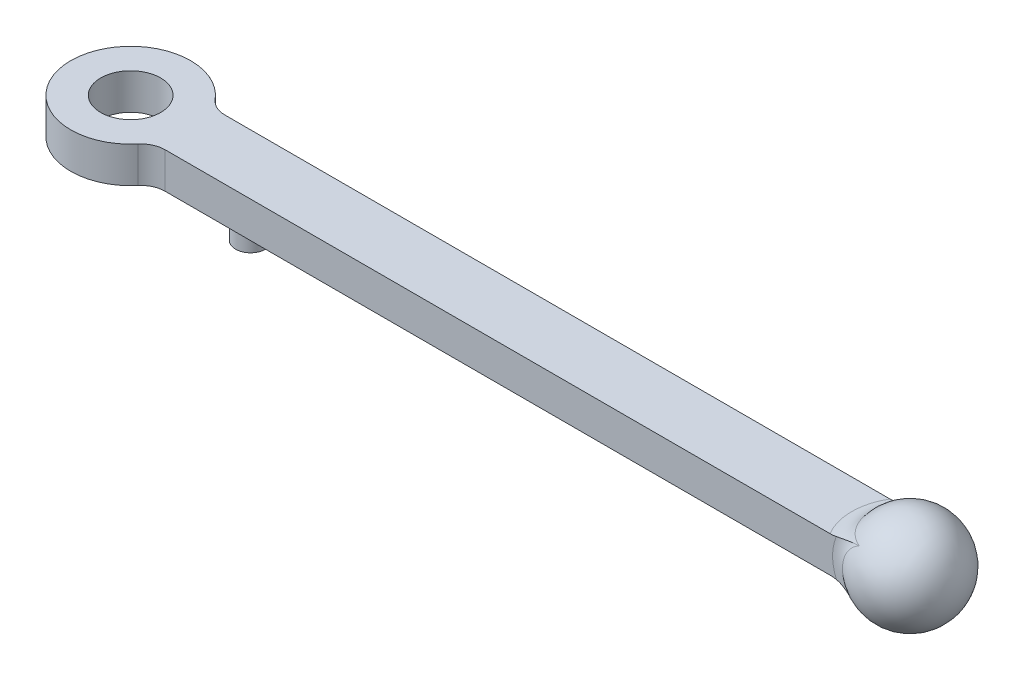
ISO-10303-21;
HEADER;
FILE_DESCRIPTION(('STEP AP214'),'2;1');
FILE_NAME('part.step','',(''),(''),'','','');
FILE_SCHEMA(('AUTOMOTIVE_DESIGN { 1 0 10303 214 1 1 1 1 }'));
ENDSEC;
DATA;
#1=APPLICATION_CONTEXT('core data for automotive mechanical design processes');
#2=APPLICATION_PROTOCOL_DEFINITION('international standard','automotive_design',2000,#1);
#3=PRODUCT_CONTEXT('',#1,'mechanical');
#4=PRODUCT('Part','Part','',(#3));
#5=PRODUCT_RELATED_PRODUCT_CATEGORY('part','',(#4));
#6=PRODUCT_DEFINITION_FORMATION('','',#4);
#7=PRODUCT_DEFINITION_CONTEXT('part definition',#1,'design');
#8=PRODUCT_DEFINITION('design','',#6,#7);
#9=PRODUCT_DEFINITION_SHAPE('','',#8);
#10=(LENGTH_UNIT() NAMED_UNIT(*) SI_UNIT(.MILLI.,.METRE.));
#11=(NAMED_UNIT(*) PLANE_ANGLE_UNIT() SI_UNIT($,.RADIAN.));
#12=(NAMED_UNIT(*) SI_UNIT($,.STERADIAN.) SOLID_ANGLE_UNIT());
#13=UNCERTAINTY_MEASURE_WITH_UNIT(LENGTH_MEASURE(1.E-05),#10,'distance_accuracy_value','');
#14=(GEOMETRIC_REPRESENTATION_CONTEXT(3) GLOBAL_UNCERTAINTY_ASSIGNED_CONTEXT((#13)) GLOBAL_UNIT_ASSIGNED_CONTEXT((#10,
#11,#12)) REPRESENTATION_CONTEXT('',''));
#15=CARTESIAN_POINT('',(0.,0.,0.));
#16=DIRECTION('',(0.,0.,1.));
#17=DIRECTION('',(1.,0.,0.));
#18=AXIS2_PLACEMENT_3D('',#15,#16,#17);
#19=CARTESIAN_POINT('',(0.,6.,0.));
#20=DIRECTION('',(0.,-1.,0.));
#21=DIRECTION('',(0.,0.,-1.));
#22=AXIS2_PLACEMENT_3D('',#19,#20,#21);
#23=CYLINDRICAL_SURFACE('',#22,10.);
#24=CARTESIAN_POINT('',(0.,6.,0.));
#25=DIRECTION('',(0.,1.,0.));
#26=DIRECTION('',(0.,0.,1.));
#27=AXIS2_PLACEMENT_3D('',#24,#25,#26);
#28=CIRCLE('',#27,10.);
#29=CARTESIAN_POINT('',(7.65986092483116,6.,-6.42857142857142));
#30=VERTEX_POINT('',#29);
#31=CARTESIAN_POINT('',(7.65986092483116,6.,6.42857142857142));
#32=VERTEX_POINT('',#31);
#33=EDGE_CURVE('E146',#30,#32,#28,.T.);
#34=ORIENTED_EDGE('',*,*,#33,.F.);
#35=DIRECTION('',(0.,-1.,0.));
#36=VECTOR('',#35,1.);
#37=CARTESIAN_POINT('',(7.65986092483116,6.,-6.42857142857142));
#38=LINE('',#37,#36);
#39=CARTESIAN_POINT('',(7.65986092483116,0.,-6.42857142857142));
#40=VERTEX_POINT('',#39);
#41=EDGE_CURVE('E132',#30,#40,#38,.T.);
#42=ORIENTED_EDGE('',*,*,#41,.T.);
#43=CARTESIAN_POINT('',(0.,0.,0.));
#44=DIRECTION('',(0.,1.,0.));
#45=DIRECTION('',(0.,0.,1.));
#46=AXIS2_PLACEMENT_3D('',#43,#44,#45);
#47=CIRCLE('',#46,10.);
#48=CARTESIAN_POINT('',(7.65986092483116,0.,6.42857142857142));
#49=VERTEX_POINT('',#48);
#50=EDGE_CURVE('E143',#40,#49,#47,.T.);
#51=ORIENTED_EDGE('',*,*,#50,.T.);
#52=DIRECTION('',(0.,-1.,0.));
#53=VECTOR('',#52,1.);
#54=CARTESIAN_POINT('',(7.65986092483116,6.,6.42857142857142));
#55=LINE('',#54,#53);
#56=EDGE_CURVE('E147',#49,#32,#55,.F.);
#57=ORIENTED_EDGE('',*,*,#56,.T.);
#58=EDGE_LOOP('',(#34,#42,#51,#57));
#59=FACE_BOUND('',#58,.T.);
#60=ADVANCED_FACE('F50',(#59),#23,.T.);
#61=CARTESIAN_POINT('',(0.,6.,0.));
#62=DIRECTION('',(0.,1.,0.));
#63=DIRECTION('',(0.,0.,1.));
#64=AXIS2_PLACEMENT_3D('',#61,#62,#63);
#65=PLANE('',#64);
#66=CARTESIAN_POINT('',(0.,6.,0.));
#67=DIRECTION('',(0.,-1.,0.));
#68=DIRECTION('',(0.,0.,-1.));
#69=AXIS2_PLACEMENT_3D('',#66,#67,#68);
#70=CIRCLE('',#69,5.);
#71=CARTESIAN_POINT('',(0.,6.,-5.));
#72=VERTEX_POINT('',#71);
#73=EDGE_CURVE('E257',#72,#72,#70,.T.);
#74=ORIENTED_EDGE('',*,*,#73,.T.);
#75=EDGE_LOOP('',(#74));
#76=FACE_BOUND('',#75,.T.);
#77=DIRECTION('',(-1.,0.,0.));
#78=VECTOR('',#77,1.);
#79=CARTESIAN_POINT('',(130.,6.,4.99999999999999));
#80=LINE('',#79,#78);
#81=CARTESIAN_POINT('',(121.633399734659,6.,4.99999999999999));
#82=VERTEX_POINT('',#81);
#83=CARTESIAN_POINT('',(10.7238052947636,6.,4.99999999999999));
#84=VERTEX_POINT('',#83);
#85=EDGE_CURVE('E152',#82,#84,#80,.T.);
#86=ORIENTED_EDGE('',*,*,#85,.F.);
#87=CARTESIAN_POINT('',(130.,6.,0.));
#88=DIRECTION('',(0.,1.,0.));
#89=DIRECTION('',(0.,0.,1.));
#90=AXIS2_PLACEMENT_3D('',#87,#88,#89);
#91=CIRCLE('',#90,9.74679434480898);
#92=CARTESIAN_POINT('',(121.633399734659,6.,-4.99999999999999));
#93=VERTEX_POINT('',#92);
#94=EDGE_CURVE('E179',#82,#93,#91,.F.);
#95=ORIENTED_EDGE('',*,*,#94,.T.);
#96=DIRECTION('',(-1.,0.,0.));
#97=VECTOR('',#96,1.);
#98=CARTESIAN_POINT('',(130.,6.,-4.99999999999999));
#99=LINE('',#98,#97);
#100=CARTESIAN_POINT('',(10.7238052947636,6.,-4.99999999999999));
#101=VERTEX_POINT('',#100);
#102=EDGE_CURVE('E156',#93,#101,#99,.T.);
#103=ORIENTED_EDGE('',*,*,#102,.T.);
#104=CARTESIAN_POINT('',(10.7238052947636,6.,-8.99999999999999));
#105=DIRECTION('',(0.,1.,0.));
#106=DIRECTION('',(0.,0.,1.));
#107=AXIS2_PLACEMENT_3D('',#104,#105,#106);
#108=CIRCLE('',#107,4.);
#109=EDGE_CURVE('E138',#101,#30,#108,.F.);
#110=ORIENTED_EDGE('',*,*,#109,.T.);
#111=ORIENTED_EDGE('',*,*,#33,.T.);
#112=CARTESIAN_POINT('',(10.7238052947636,6.,8.99999999999999));
#113=DIRECTION('',(0.,1.,0.));
#114=DIRECTION('',(0.,0.,1.));
#115=AXIS2_PLACEMENT_3D('',#112,#113,#114);
#116=CIRCLE('',#115,4.);
#117=EDGE_CURVE('E58',#32,#84,#116,.F.);
#118=ORIENTED_EDGE('',*,*,#117,.T.);
#119=EDGE_LOOP('',(#86,#95,#103,#110,#111,#118));
#120=FACE_BOUND('',#119,.T.);
#121=ADVANCED_FACE('F279',(#76,#120),#65,.T.);
#122=CARTESIAN_POINT('',(0.,0.,0.));
#123=DIRECTION('',(0.,1.,0.));
#124=DIRECTION('',(0.,0.,1.));
#125=AXIS2_PLACEMENT_3D('',#122,#123,#124);
#126=PLANE('',#125);
#127=CARTESIAN_POINT('',(20.,0.,0.));
#128=DIRECTION('',(0.,1.,0.));
#129=DIRECTION('',(0.,0.,1.));
#130=AXIS2_PLACEMENT_3D('',#127,#128,#129);
#131=CIRCLE('',#130,2.5);
#132=CARTESIAN_POINT('',(20.,0.,2.5));
#133=VERTEX_POINT('',#132);
#134=EDGE_CURVE('E12',#133,#133,#131,.F.);
#135=ORIENTED_EDGE('',*,*,#134,.F.);
#136=EDGE_LOOP('',(#135));
#137=FACE_BOUND('',#136,.T.);
#138=CARTESIAN_POINT('',(0.,0.,0.));
#139=DIRECTION('',(0.,-1.,0.));
#140=DIRECTION('',(0.,0.,-1.));
#141=AXIS2_PLACEMENT_3D('',#138,#139,#140);
#142=CIRCLE('',#141,5.);
#143=CARTESIAN_POINT('',(0.,0.,-5.));
#144=VERTEX_POINT('',#143);
#145=EDGE_CURVE('E311',#144,#144,#142,.T.);
#146=ORIENTED_EDGE('',*,*,#145,.F.);
#147=EDGE_LOOP('',(#146));
#148=FACE_BOUND('',#147,.T.);
#149=DIRECTION('',(-1.,0.,0.));
#150=VECTOR('',#149,1.);
#151=CARTESIAN_POINT('',(130.,0.,-4.99999999999999));
#152=LINE('',#151,#150);
#153=CARTESIAN_POINT('',(121.633399734659,0.,-4.99999999999999));
#154=VERTEX_POINT('',#153);
#155=CARTESIAN_POINT('',(10.7238052947636,0.,-4.99999999999999));
#156=VERTEX_POINT('',#155);
#157=EDGE_CURVE('E163',#154,#156,#152,.T.);
#158=ORIENTED_EDGE('',*,*,#157,.F.);
#159=CARTESIAN_POINT('',(130.,0.,0.));
#160=DIRECTION('',(0.,1.,0.));
#161=DIRECTION('',(0.,0.,1.));
#162=AXIS2_PLACEMENT_3D('',#159,#160,#161);
#163=CIRCLE('',#162,9.74679434480898);
#164=CARTESIAN_POINT('',(121.633399734659,0.,4.99999999999999));
#165=VERTEX_POINT('',#164);
#166=EDGE_CURVE('E182',#154,#165,#163,.T.);
#167=ORIENTED_EDGE('',*,*,#166,.T.);
#168=DIRECTION('',(-1.,0.,0.));
#169=VECTOR('',#168,1.);
#170=CARTESIAN_POINT('',(130.,0.,4.99999999999999));
#171=LINE('',#170,#169);
#172=CARTESIAN_POINT('',(10.7238052947636,0.,4.99999999999999));
#173=VERTEX_POINT('',#172);
#174=EDGE_CURVE('E161',#165,#173,#171,.T.);
#175=ORIENTED_EDGE('',*,*,#174,.T.);
#176=CARTESIAN_POINT('',(10.7238052947636,0.,8.99999999999999));
#177=DIRECTION('',(0.,1.,0.));
#178=DIRECTION('',(0.,0.,1.));
#179=AXIS2_PLACEMENT_3D('',#176,#177,#178);
#180=CIRCLE('',#179,4.);
#181=EDGE_CURVE('E151',#173,#49,#180,.T.);
#182=ORIENTED_EDGE('',*,*,#181,.T.);
#183=ORIENTED_EDGE('',*,*,#50,.F.);
#184=CARTESIAN_POINT('',(10.7238052947636,0.,-8.99999999999999));
#185=DIRECTION('',(0.,1.,0.));
#186=DIRECTION('',(0.,0.,1.));
#187=AXIS2_PLACEMENT_3D('',#184,#185,#186);
#188=CIRCLE('',#187,4.);
#189=EDGE_CURVE('E128',#40,#156,#188,.T.);
#190=ORIENTED_EDGE('',*,*,#189,.T.);
#191=EDGE_LOOP('',(#158,#167,#175,#182,#183,#190));
#192=FACE_BOUND('',#191,.T.);
#193=ADVANCED_FACE('F149',(#137,#148,#192),#126,.F.);
#194=CARTESIAN_POINT('',(130.,6.,-4.99999999999999));
#195=DIRECTION('',(0.,0.,1.));
#196=DIRECTION('',(1.,0.,0.));
#197=AXIS2_PLACEMENT_3D('',#194,#195,#196);
#198=PLANE('',#197);
#199=ORIENTED_EDGE('',*,*,#157,.T.);
#200=DIRECTION('',(0.,1.,0.));
#201=VECTOR('',#200,1.);
#202=CARTESIAN_POINT('',(10.7238052947636,6.,-4.99999999999999));
#203=LINE('',#202,#201);
#204=EDGE_CURVE('E133',#156,#101,#203,.T.);
#205=ORIENTED_EDGE('',*,*,#204,.T.);
#206=ORIENTED_EDGE('',*,*,#102,.F.);
#207=CARTESIAN_POINT('',(121.633399734659,6.,-5.));
#208=CARTESIAN_POINT('',(121.722384322352,5.99999884234618,-4.99999999999999));
#209=CARTESIAN_POINT('',(121.811363314964,6.0021878460266,-4.99999999999999));
#210=CARTESIAN_POINT('',(121.988921595095,6.01081724651076,-4.99999999999999));
#211=CARTESIAN_POINT('',(122.07750133107,6.0172483781634,-4.99999999999999));
#212=CARTESIAN_POINT('',(122.254251260499,6.03423315654551,-4.99999999999999));
#213=CARTESIAN_POINT('',(122.342421501071,6.04478631644939,-4.99999999999999));
#214=CARTESIAN_POINT('',(122.518383640926,6.06991707674573,-4.99999999999999));
#215=CARTESIAN_POINT('',(122.60617429535,6.08450340576668,-4.99999999999999));
#216=CARTESIAN_POINT('',(122.693592598182,6.1010338402954,-4.99999999999999));
#217=B_SPLINE_CURVE_WITH_KNOTS('',3,(#207,#208,#209,#210,#211,#212,#213,#214,#215,#216),
.UNSPECIFIED.,.F.,.F.,(4,2,2,2,4),(0.,0.266918788788639,0.533256527079682,0.799562819482248,
1.06645002783183),.UNSPECIFIED.);
#218=CARTESIAN_POINT('',(122.693592598182,6.10103384029539,-4.99999999999999));
#219=VERTEX_POINT('',#218);
#220=EDGE_CURVE('E196',#93,#219,#217,.T.);
#221=ORIENTED_EDGE('',*,*,#220,.T.);
#222=CARTESIAN_POINT('',(130.,3.,-4.99999999999999));
#223=DIRECTION('',(0.,0.,1.));
#224=DIRECTION('',(1.,0.,0.));
#225=AXIS2_PLACEMENT_3D('',#222,#223,#224);
#226=CIRCLE('',#225,7.9372539331938);
#227=CARTESIAN_POINT('',(122.693592598182,-0.101033840295392,-4.99999999999999));
#228=VERTEX_POINT('',#227);
#229=EDGE_CURVE('E73',#219,#228,#226,.T.);
#230=ORIENTED_EDGE('',*,*,#229,.T.);
#231=CARTESIAN_POINT('',(122.693592598182,-0.101033840295392,-4.99999999999999));
#232=CARTESIAN_POINT('',(122.60617429535,-0.084503405766678,-4.99999999999999));
#233=CARTESIAN_POINT('',(122.518383640926,-0.0699170767457262,-4.99999999999999));
#234=CARTESIAN_POINT('',(122.342421501071,-0.0447863164493941,-4.99999999999999));
#235=CARTESIAN_POINT('',(122.254251260499,-0.034233156545515,-4.99999999999999));
#236=CARTESIAN_POINT('',(122.07750133107,-0.0172483781634058,-4.99999999999999));
#237=CARTESIAN_POINT('',(121.988921595095,-0.0108172465107657,-4.99999999999999));
#238=CARTESIAN_POINT('',(121.811363314964,-0.00218784602659644,-4.99999999999999));
#239=CARTESIAN_POINT('',(121.722384322352,1.15765382279565E-06,-4.99999999999999));
#240=CARTESIAN_POINT('',(121.633399734659,0.,-4.99999999999999));
#241=B_SPLINE_CURVE_WITH_KNOTS('',3,(#231,#232,#233,#234,#235,#236,#237,#238,#239,#240),
.UNSPECIFIED.,.F.,.F.,(4,2,2,2,4),(0.,0.266887208349581,0.533193500752133,0.799531239043176,
1.06645002783182),.UNSPECIFIED.);
#242=EDGE_CURVE('E221',#228,#154,#241,.T.);
#243=ORIENTED_EDGE('',*,*,#242,.T.);
#244=EDGE_LOOP('',(#199,#205,#206,#221,#230,#243));
#245=FACE_BOUND('',#244,.T.);
#246=ADVANCED_FACE('F211',(#245),#198,.F.);
#247=CARTESIAN_POINT('',(130.,6.,4.99999999999999));
#248=DIRECTION('',(0.,0.,1.));
#249=DIRECTION('',(1.,0.,0.));
#250=AXIS2_PLACEMENT_3D('',#247,#248,#249);
#251=PLANE('',#250);
#252=CARTESIAN_POINT('',(121.633399734659,0.,5.));
#253=CARTESIAN_POINT('',(121.722384322352,1.15765382337852E-06,4.99999999999999));
#254=CARTESIAN_POINT('',(121.811363314964,-0.00218784602659558,4.99999999999999));
#255=CARTESIAN_POINT('',(121.988921595095,-0.0108172465107645,4.99999999999999));
#256=CARTESIAN_POINT('',(122.07750133107,-0.0172483781634045,4.99999999999999));
#257=CARTESIAN_POINT('',(122.254251260499,-0.0342331565455136,4.99999999999999));
#258=CARTESIAN_POINT('',(122.342421501071,-0.044786316449393,4.99999999999999));
#259=CARTESIAN_POINT('',(122.518383640926,-0.0699170767457263,4.99999999999999));
#260=CARTESIAN_POINT('',(122.60617429535,-0.0845034057666789,4.99999999999999));
#261=CARTESIAN_POINT('',(122.693592598182,-0.101033840295395,4.99999999999999));
#262=B_SPLINE_CURVE_WITH_KNOTS('',3,(#252,#253,#254,#255,#256,#257,#258,#259,#260,#261),
.UNSPECIFIED.,.F.,.F.,(4,2,2,2,4),(0.,0.266918788788639,0.533256527079682,0.799562819482248,
1.06645002783183),.UNSPECIFIED.);
#263=CARTESIAN_POINT('',(122.693592598182,-0.101033840295392,4.99999999999999));
#264=VERTEX_POINT('',#263);
#265=EDGE_CURVE('E216',#165,#264,#262,.T.);
#266=ORIENTED_EDGE('',*,*,#265,.T.);
#267=CARTESIAN_POINT('',(130.,3.,4.99999999999999));
#268=DIRECTION('',(0.,0.,1.));
#269=DIRECTION('',(1.,0.,0.));
#270=AXIS2_PLACEMENT_3D('',#267,#268,#269);
#271=CIRCLE('',#270,7.9372539331938);
#272=CARTESIAN_POINT('',(122.693592598182,6.10103384029539,4.99999999999999));
#273=VERTEX_POINT('',#272);
#274=EDGE_CURVE('E65',#264,#273,#271,.F.);
#275=ORIENTED_EDGE('',*,*,#274,.T.);
#276=CARTESIAN_POINT('',(122.693592598182,6.10103384029539,4.99999999999999));
#277=CARTESIAN_POINT('',(122.60617429535,6.08450340576668,4.99999999999999));
#278=CARTESIAN_POINT('',(122.518383640926,6.06991707674573,4.99999999999999));
#279=CARTESIAN_POINT('',(122.342421501071,6.04478631644939,4.99999999999999));
#280=CARTESIAN_POINT('',(122.254251260499,6.03423315654552,4.99999999999999));
#281=CARTESIAN_POINT('',(122.07750133107,6.01724837816341,4.99999999999999));
#282=CARTESIAN_POINT('',(121.988921595095,6.01081724651077,4.99999999999999));
#283=CARTESIAN_POINT('',(121.811363314964,6.0021878460266,4.99999999999999));
#284=CARTESIAN_POINT('',(121.722384322352,5.99999884234618,4.99999999999999));
#285=CARTESIAN_POINT('',(121.633399734659,6.,4.99999999999999));
#286=B_SPLINE_CURVE_WITH_KNOTS('',3,(#276,#277,#278,#279,#280,#281,#282,#283,#284,#285),
.UNSPECIFIED.,.F.,.F.,(4,2,2,2,4),(0.,0.266887208349581,0.533193500752133,0.799531239043176,
1.06645002783182),.UNSPECIFIED.);
#287=EDGE_CURVE('E189',#273,#82,#286,.T.);
#288=ORIENTED_EDGE('',*,*,#287,.T.);
#289=ORIENTED_EDGE('',*,*,#85,.T.);
#290=DIRECTION('',(0.,-1.,0.));
#291=VECTOR('',#290,1.);
#292=CARTESIAN_POINT('',(10.7238052947636,6.,4.99999999999999));
#293=LINE('',#292,#291);
#294=EDGE_CURVE('E184',#84,#173,#293,.T.);
#295=ORIENTED_EDGE('',*,*,#294,.T.);
#296=ORIENTED_EDGE('',*,*,#174,.F.);
#297=EDGE_LOOP('',(#266,#275,#288,#289,#295,#296));
#298=FACE_BOUND('',#297,.T.);
#299=ADVANCED_FACE('F206',(#298),#251,.T.);
#300=CARTESIAN_POINT('',(130.,3.,0.));
#301=DIRECTION('',(-1.,0.,0.));
#302=DIRECTION('',(0.,0.,-1.));
#303=AXIS2_PLACEMENT_3D('',#300,#301,#302);
#304=SPHERICAL_SURFACE('',#303,8.00000000000001);
#305=CARTESIAN_POINT('',(130.,3.,-6.));
#306=DIRECTION('',(0.,0.,1.));
#307=DIRECTION('',(1.,0.,0.));
#308=AXIS2_PLACEMENT_3D('',#305,#306,#307);
#309=CIRCLE('',#308,5.2915026221292);
#310=CARTESIAN_POINT('',(127.505561742151,-1.66666666666667,-6.));
#311=VERTEX_POINT('',#310);
#312=CARTESIAN_POINT('',(127.505561742151,7.66666666666667,-6.));
#313=VERTEX_POINT('',#312);
#314=EDGE_CURVE('E174',#311,#313,#309,.F.);
#315=ORIENTED_EDGE('',*,*,#314,.T.);
#316=CARTESIAN_POINT('',(130.,7.66666666666667,0.));
#317=DIRECTION('',(0.,-1.,0.));
#318=DIRECTION('',(0.,0.,-1.));
#319=AXIS2_PLACEMENT_3D('',#316,#317,#318);
#320=CIRCLE('',#319,6.49786289653933);
#321=CARTESIAN_POINT('',(127.505561742151,7.66666666666667,6.));
#322=VERTEX_POINT('',#321);
#323=EDGE_CURVE('E176',#313,#322,#320,.F.);
#324=ORIENTED_EDGE('',*,*,#323,.T.);
#325=CARTESIAN_POINT('',(130.,3.,6.));
#326=DIRECTION('',(0.,0.,-1.));
#327=DIRECTION('',(-1.,0.,0.));
#328=AXIS2_PLACEMENT_3D('',#325,#326,#327);
#329=CIRCLE('',#328,5.2915026221292);
#330=CARTESIAN_POINT('',(127.505561742151,-1.66666666666667,6.));
#331=VERTEX_POINT('',#330);
#332=EDGE_CURVE('E170',#322,#331,#329,.F.);
#333=ORIENTED_EDGE('',*,*,#332,.T.);
#334=CARTESIAN_POINT('',(130.,-1.66666666666667,0.));
#335=DIRECTION('',(0.,1.,0.));
#336=DIRECTION('',(0.,0.,1.));
#337=AXIS2_PLACEMENT_3D('',#334,#335,#336);
#338=CIRCLE('',#337,6.49786289653933);
#339=EDGE_CURVE('E172',#331,#311,#338,.F.);
#340=ORIENTED_EDGE('',*,*,#339,.T.);
#341=EDGE_LOOP('',(#315,#324,#333,#340));
#342=FACE_BOUND('',#341,.T.);
#343=ADVANCED_FACE('F210',(#342),#304,.T.);
#344=CARTESIAN_POINT('',(10.7238052947636,6.,-8.99999999999999));
#345=DIRECTION('',(0.,-1.,0.));
#346=DIRECTION('',(0.,0.,-1.));
#347=AXIS2_PLACEMENT_3D('',#344,#345,#346);
#348=CYLINDRICAL_SURFACE('',#347,4.);
#349=ORIENTED_EDGE('',*,*,#109,.F.);
#350=ORIENTED_EDGE('',*,*,#204,.F.);
#351=ORIENTED_EDGE('',*,*,#189,.F.);
#352=ORIENTED_EDGE('',*,*,#41,.F.);
#353=EDGE_LOOP('',(#349,#350,#351,#352));
#354=FACE_BOUND('',#353,.T.);
#355=ADVANCED_FACE('F131',(#354),#348,.F.);
#356=CARTESIAN_POINT('',(130.,-4.,0.));
#357=DIRECTION('',(0.,1.,0.));
#358=DIRECTION('',(0.,0.,1.));
#359=AXIS2_PLACEMENT_3D('',#356,#357,#358);
#360=TOROIDAL_SURFACE('',#359,9.74679434480898,4.);
#361=ORIENTED_EDGE('',*,*,#166,.F.);
#362=ORIENTED_EDGE('',*,*,#242,.F.);
#363=CARTESIAN_POINT('',(122.693592598182,-0.101033840295392,-4.99999999999999));
#364=CARTESIAN_POINT('',(122.796805245126,-0.120556766416337,-5.00000650980065));
#365=CARTESIAN_POINT('',(122.899506864971,-0.142404317630717,-5.00286291111811));
#366=CARTESIAN_POINT('',(123.103629736308,-0.189957499172352,-5.01352883726657));
#367=CARTESIAN_POINT('',(123.205052412348,-0.215658331691491,-5.02133224094025));
#368=CARTESIAN_POINT('',(123.406104287569,-0.270040840217628,-5.04109901062155));
#369=CARTESIAN_POINT('',(123.505739968114,-0.29870676177681,-5.05304110996936));
#370=CARTESIAN_POINT('',(123.703811462101,-0.358488579065251,-5.08043938959706));
#371=CARTESIAN_POINT('',(123.802246861316,-0.389605294410727,-5.09589674877117));
#372=CARTESIAN_POINT('',(124.094585861306,-0.485313990453983,-5.14639623423198));
#373=CARTESIAN_POINT('',(124.28684551926,-0.552639242107431,-5.18571283965847));
#374=CARTESIAN_POINT('',(124.66859163546,-0.690879151698414,-5.27176319409893));
#375=CARTESIAN_POINT('',(124.858073954341,-0.761798579318026,-5.31850698478113));
#376=CARTESIAN_POINT('',(125.21040312694,-0.894564052718569,-5.40948647141377));
#377=CARTESIAN_POINT('',(125.373406608087,-0.956348315688617,-5.45321470185601));
#378=CARTESIAN_POINT('',(125.699527504713,-1.07858302924827,-5.54181495691489));
#379=CARTESIAN_POINT('',(125.862644852539,-1.13903398219063,-5.58668653652622));
#380=CARTESIAN_POINT('',(126.190062658265,-1.25710320967802,-5.67589183693611));
#381=CARTESIAN_POINT('',(126.354363145209,-1.31472141440851,-5.72022554445828));
#382=CARTESIAN_POINT('',(126.684968375155,-1.42568368973965,-5.80676220826336));
#383=CARTESIAN_POINT('',(126.85127292077,-1.47902817737902,-5.84896537230037));
#384=CARTESIAN_POINT('',(127.089313052956,-1.55077209677285,-5.90631469336407));
#385=CARTESIAN_POINT('',(127.159986058333,-1.57150341303574,-5.92296395556768));
#386=CARTESIAN_POINT('',(127.301821430917,-1.61186678163206,-5.95551012187922));
#387=CARTESIAN_POINT('',(127.372983806814,-1.63149881438917,-5.97140701258795));
#388=CARTESIAN_POINT('',(127.460491276384,-1.65481943993652,-5.99035863442022));
#389=CARTESIAN_POINT('',(127.476597467137,-1.65907782758869,-5.99382213796835));
#390=CARTESIAN_POINT('',(127.496997395233,-1.66442788301395,-5.99817705296717));
#391=CARTESIAN_POINT('',(127.501279111172,-1.66554837329319,-5.99908932323008));
#392=CARTESIAN_POINT('',(127.505561742151,-1.66666666666667,-6.));
#393=B_SPLINE_CURVE_WITH_KNOTS('',3,(#363,#364,#365,#366,#367,#368,#369,#370,#371,#372,#373,
#374,#375,#376,#377,#378,#379,#380,#381,#382,#383,#384,#385,#386,#387,#388,#389,#390,#391,#392),
.UNSPECIFIED.,.F.,.F.,(4,2,2,2,2,2,2,2,2,2,2,2,2,2,4),(0.,0.314962155710315,0.629535352643543,
0.942515513853669,1.25560079276903,1.87763262970749,2.50051273365314,3.03966514727089,
3.57861082843448,4.11756978553965,4.65647608562172,4.88299367210202,5.10951529118376,
5.16056273306214,5.17411955386574),.UNSPECIFIED.);
#394=EDGE_CURVE('E165',#311,#228,#393,.F.);
#395=ORIENTED_EDGE('',*,*,#394,.F.);
#396=ORIENTED_EDGE('',*,*,#339,.F.);
#397=CARTESIAN_POINT('',(122.693592598182,-0.101033840295392,4.99999999999999));
#398=CARTESIAN_POINT('',(122.796805245126,-0.120556766416337,5.00000650980065));
#399=CARTESIAN_POINT('',(122.899506864971,-0.142404317630715,5.00286291111811));
#400=CARTESIAN_POINT('',(123.103629736308,-0.189957499172348,5.01352883726657));
#401=CARTESIAN_POINT('',(123.205052412348,-0.215658331691487,5.02133224094024));
#402=CARTESIAN_POINT('',(123.406104287569,-0.270040840217625,5.04109901062154));
#403=CARTESIAN_POINT('',(123.505739968114,-0.298706761776808,5.05304110996936));
#404=CARTESIAN_POINT('',(123.703811462101,-0.358488579065252,5.08043938959706));
#405=CARTESIAN_POINT('',(123.802246861316,-0.389605294410728,5.09589674877117));
#406=CARTESIAN_POINT('',(124.094585861306,-0.485313990453984,5.14639623423198));
#407=CARTESIAN_POINT('',(124.28684551926,-0.552639242107432,5.18571283965847));
#408=CARTESIAN_POINT('',(124.66859163546,-0.690879151698414,5.27176319409893));
#409=CARTESIAN_POINT('',(124.858073954341,-0.761798579318026,5.31850698478113));
#410=CARTESIAN_POINT('',(125.21040312694,-0.894564052718569,5.40948647141377));
#411=CARTESIAN_POINT('',(125.373406608087,-0.956348315688619,5.45321470185601));
#412=CARTESIAN_POINT('',(125.699527504713,-1.07858302924827,5.54181495691489));
#413=CARTESIAN_POINT('',(125.862644852539,-1.13903398219063,5.58668653652621));
#414=CARTESIAN_POINT('',(126.190062658265,-1.25710320967802,5.67589183693611));
#415=CARTESIAN_POINT('',(126.354363145209,-1.31472141440851,5.72022554445828));
#416=CARTESIAN_POINT('',(126.684968375155,-1.42568368973965,5.80676220826336));
#417=CARTESIAN_POINT('',(126.85127292077,-1.47902817737902,5.84896537230037));
#418=CARTESIAN_POINT('',(127.089313052956,-1.55077209677285,5.90631469336407));
#419=CARTESIAN_POINT('',(127.159986058333,-1.57150341303574,5.92296395556768));
#420=CARTESIAN_POINT('',(127.301821430917,-1.61186678163206,5.95551012187922));
#421=CARTESIAN_POINT('',(127.372983806814,-1.63149881438917,5.97140701258795));
#422=CARTESIAN_POINT('',(127.460491276384,-1.65481943993652,5.99035863442022));
#423=CARTESIAN_POINT('',(127.476597467137,-1.65907782758869,5.99382213796836));
#424=CARTESIAN_POINT('',(127.496997395233,-1.66442788301395,5.99817705296717));
#425=CARTESIAN_POINT('',(127.501279111172,-1.66554837329319,5.99908932323008));
#426=CARTESIAN_POINT('',(127.505561742151,-1.66666666666667,6.));
#427=B_SPLINE_CURVE_WITH_KNOTS('',3,(#397,#398,#399,#400,#401,#402,#403,#404,#405,#406,#407,
#408,#409,#410,#411,#412,#413,#414,#415,#416,#417,#418,#419,#420,#421,#422,#423,#424,#425,#426),
.UNSPECIFIED.,.F.,.F.,(4,2,2,2,2,2,2,2,2,2,2,2,2,2,4),(0.,0.314962155710301,0.629535352643529,
0.942515513853669,1.25560079276903,1.87763262970749,2.50051273365314,3.03966514727089,
3.57861082843448,4.11756978553964,4.65647608562172,4.88299367210202,5.10951529118376,
5.16056273306214,5.17411955386574),.UNSPECIFIED.);
#428=EDGE_CURVE('E236',#264,#331,#427,.T.);
#429=ORIENTED_EDGE('',*,*,#428,.F.);
#430=ORIENTED_EDGE('',*,*,#265,.F.);
#431=EDGE_LOOP('',(#361,#362,#395,#396,#429,#430));
#432=FACE_BOUND('',#431,.T.);
#433=ADVANCED_FACE('F226',(#432),#360,.F.);
#434=CARTESIAN_POINT('',(130.,3.,-8.99999999999999));
#435=DIRECTION('',(0.,0.,1.));
#436=DIRECTION('',(1.,0.,0.));
#437=AXIS2_PLACEMENT_3D('',#434,#435,#436);
#438=TOROIDAL_SURFACE('',#437,7.9372539331938,4.);
#439=ORIENTED_EDGE('',*,*,#229,.F.);
#440=CARTESIAN_POINT('',(122.693592598182,6.10103384029539,-4.99999999999999));
#441=CARTESIAN_POINT('',(122.796805245126,6.12055676641633,-5.00000650980065));
#442=CARTESIAN_POINT('',(122.899506864971,6.1424043176307,-5.0028629111181));
#443=CARTESIAN_POINT('',(123.103629736308,6.18995749917232,-5.01352883726656));
#444=CARTESIAN_POINT('',(123.205052412348,6.21565833169145,-5.02133224094023));
#445=CARTESIAN_POINT('',(123.406104287569,6.27004084021756,-5.04109901062152));
#446=CARTESIAN_POINT('',(123.505739968114,6.29870676177673,-5.05304110996933));
#447=CARTESIAN_POINT('',(123.703811462101,6.35848857906515,-5.080439389597));
#448=CARTESIAN_POINT('',(123.802246861316,6.38960529441061,-5.09589674877111));
#449=CARTESIAN_POINT('',(124.094585861305,6.48531399045387,-5.14639623423192));
#450=CARTESIAN_POINT('',(124.28684551926,6.55263924210734,-5.18571283965842));
#451=CARTESIAN_POINT('',(124.66859163546,6.69087915169837,-5.27176319409889));
#452=CARTESIAN_POINT('',(124.858073954341,6.761798579318,-5.31850698478112));
#453=CARTESIAN_POINT('',(125.21040312694,6.89456405271858,-5.40948647141377));
#454=CARTESIAN_POINT('',(125.373406608088,6.95634831568864,-5.45321470185601));
#455=CARTESIAN_POINT('',(125.699527504713,7.0785830292483,-5.54181495691492));
#456=CARTESIAN_POINT('',(125.86264485254,7.13903398219065,-5.58668653652627));
#457=CARTESIAN_POINT('',(126.190062658265,7.25710320967808,-5.67589183693612));
#458=CARTESIAN_POINT('',(126.354363145209,7.31472141440862,-5.72022554445824));
#459=CARTESIAN_POINT('',(126.684968375155,7.42568368973958,-5.80676220826344));
#460=CARTESIAN_POINT('',(126.85127292077,7.47902817737871,-5.84896537230063));
#461=CARTESIAN_POINT('',(127.089313052956,7.55077209677299,-5.90631469336395));
#462=CARTESIAN_POINT('',(127.159986058333,7.5715034130361,-5.92296395556736));
#463=CARTESIAN_POINT('',(127.301821430917,7.61186678163165,-5.9555101218795));
#464=CARTESIAN_POINT('',(127.372983806814,7.63149881438777,-5.97140701258903));
#465=CARTESIAN_POINT('',(127.460491276384,7.65481943993676,-5.99035863441998));
#466=CARTESIAN_POINT('',(127.476597467137,7.65907782758936,-5.99382213796779));
#467=CARTESIAN_POINT('',(127.496997395233,7.66442788301427,-5.99817705296691));
#468=CARTESIAN_POINT('',(127.501279111172,7.66554837329338,-5.99908932322992));
#469=CARTESIAN_POINT('',(127.505561742151,7.66666666666667,-6.));
#470=B_SPLINE_CURVE_WITH_KNOTS('',3,(#440,#441,#442,#443,#444,#445,#446,#447,#448,#449,#450,
#451,#452,#453,#454,#455,#456,#457,#458,#459,#460,#461,#462,#463,#464,#465,#466,#467,#468,#469),
.UNSPECIFIED.,.F.,.F.,(4,2,2,2,2,2,2,2,2,2,2,2,2,2,4),(0.,0.314962155710201,0.629535352643327,
0.942515513853347,1.2556007927686,1.87763262970728,2.50051273365314,3.03966514727098,
3.57861082843463,4.11756978553973,4.65647608562172,4.8829936721019,5.10951529118363,
5.16056273306212,5.17411955386574),.UNSPECIFIED.);
#471=EDGE_CURVE('E249',#313,#219,#470,.F.);
#472=ORIENTED_EDGE('',*,*,#471,.F.);
#473=ORIENTED_EDGE('',*,*,#314,.F.);
#474=ORIENTED_EDGE('',*,*,#394,.T.);
#475=EDGE_LOOP('',(#439,#472,#473,#474));
#476=FACE_BOUND('',#475,.T.);
#477=ADVANCED_FACE('F230',(#476),#438,.F.);
#478=CARTESIAN_POINT('',(130.,3.,8.99999999999999));
#479=DIRECTION('',(0.,0.,1.));
#480=DIRECTION('',(1.,0.,0.));
#481=AXIS2_PLACEMENT_3D('',#478,#479,#480);
#482=TOROIDAL_SURFACE('',#481,7.9372539331938,4.);
#483=ORIENTED_EDGE('',*,*,#428,.T.);
#484=ORIENTED_EDGE('',*,*,#332,.F.);
#485=CARTESIAN_POINT('',(122.693592598182,6.10103384029539,4.99999999999999));
#486=CARTESIAN_POINT('',(122.796805245126,6.12055676641633,5.00000650980065));
#487=CARTESIAN_POINT('',(122.899506864971,6.1424043176307,5.0028629111181));
#488=CARTESIAN_POINT('',(123.103629736308,6.18995749917232,5.01352883726656));
#489=CARTESIAN_POINT('',(123.205052412348,6.21565833169145,5.02133224094023));
#490=CARTESIAN_POINT('',(123.406104287569,6.27004084021756,5.04109901062152));
#491=CARTESIAN_POINT('',(123.505739968114,6.29870676177673,5.05304110996933));
#492=CARTESIAN_POINT('',(123.703811462101,6.35848857906515,5.080439389597));
#493=CARTESIAN_POINT('',(123.802246861316,6.38960529441061,5.09589674877111));
#494=CARTESIAN_POINT('',(124.094585861305,6.48531399045387,5.14639623423192));
#495=CARTESIAN_POINT('',(124.28684551926,6.55263924210734,5.18571283965842));
#496=CARTESIAN_POINT('',(124.66859163546,6.69087915169837,5.27176319409889));
#497=CARTESIAN_POINT('',(124.858073954341,6.761798579318,5.31850698478112));
#498=CARTESIAN_POINT('',(125.21040312694,6.89456405271858,5.40948647141377));
#499=CARTESIAN_POINT('',(125.373406608088,6.95634831568864,5.45321470185601));
#500=CARTESIAN_POINT('',(125.699527504713,7.0785830292483,5.54181495691492));
#501=CARTESIAN_POINT('',(125.86264485254,7.13903398219065,5.58668653652627));
#502=CARTESIAN_POINT('',(126.190062658265,7.25710320967808,5.67589183693612));
#503=CARTESIAN_POINT('',(126.354363145209,7.31472141440862,5.72022554445824));
#504=CARTESIAN_POINT('',(126.684968375155,7.42568368973958,5.80676220826344));
#505=CARTESIAN_POINT('',(126.85127292077,7.47902817737871,5.84896537230063));
#506=CARTESIAN_POINT('',(127.089313052956,7.55077209677299,5.90631469336395));
#507=CARTESIAN_POINT('',(127.159986058333,7.5715034130361,5.92296395556736));
#508=CARTESIAN_POINT('',(127.301821430917,7.61186678163165,5.9555101218795));
#509=CARTESIAN_POINT('',(127.372983806814,7.63149881438777,5.97140701258903));
#510=CARTESIAN_POINT('',(127.460491276384,7.65481943993676,5.99035863441998));
#511=CARTESIAN_POINT('',(127.476597467137,7.65907782758936,5.99382213796779));
#512=CARTESIAN_POINT('',(127.496997395233,7.66442788301427,5.99817705296691));
#513=CARTESIAN_POINT('',(127.501279111172,7.66554837329338,5.99908932322992));
#514=CARTESIAN_POINT('',(127.505561742151,7.66666666666667,6.));
#515=B_SPLINE_CURVE_WITH_KNOTS('',3,(#485,#486,#487,#488,#489,#490,#491,#492,#493,#494,#495,
#496,#497,#498,#499,#500,#501,#502,#503,#504,#505,#506,#507,#508,#509,#510,#511,#512,#513,#514),
.UNSPECIFIED.,.F.,.F.,(4,2,2,2,2,2,2,2,2,2,2,2,2,2,4),(0.,0.314962155710201,0.629535352643327,
0.942515513853347,1.2556007927686,1.87763262970728,2.50051273365314,3.03966514727098,
3.57861082843463,4.11756978553973,4.65647608562172,4.8829936721019,5.10951529118363,
5.16056273306212,5.17411955386574),.UNSPECIFIED.);
#516=EDGE_CURVE('E253',#273,#322,#515,.T.);
#517=ORIENTED_EDGE('',*,*,#516,.F.);
#518=ORIENTED_EDGE('',*,*,#274,.F.);
#519=EDGE_LOOP('',(#483,#484,#517,#518));
#520=FACE_BOUND('',#519,.T.);
#521=ADVANCED_FACE('F266',(#520),#482,.F.);
#522=CARTESIAN_POINT('',(130.,10.,0.));
#523=DIRECTION('',(0.,1.,0.));
#524=DIRECTION('',(0.,0.,1.));
#525=AXIS2_PLACEMENT_3D('',#522,#523,#524);
#526=TOROIDAL_SURFACE('',#525,9.74679434480898,4.);
#527=ORIENTED_EDGE('',*,*,#220,.F.);
#528=ORIENTED_EDGE('',*,*,#94,.F.);
#529=ORIENTED_EDGE('',*,*,#287,.F.);
#530=ORIENTED_EDGE('',*,*,#516,.T.);
#531=ORIENTED_EDGE('',*,*,#323,.F.);
#532=ORIENTED_EDGE('',*,*,#471,.T.);
#533=EDGE_LOOP('',(#527,#528,#529,#530,#531,#532));
#534=FACE_BOUND('',#533,.T.);
#535=ADVANCED_FACE('F202',(#534),#526,.F.);
#536=CARTESIAN_POINT('',(10.7238052947636,6.,8.99999999999999));
#537=DIRECTION('',(0.,-1.,0.));
#538=DIRECTION('',(0.,0.,-1.));
#539=AXIS2_PLACEMENT_3D('',#536,#537,#538);
#540=CYLINDRICAL_SURFACE('',#539,4.);
#541=ORIENTED_EDGE('',*,*,#117,.F.);
#542=ORIENTED_EDGE('',*,*,#56,.F.);
#543=ORIENTED_EDGE('',*,*,#181,.F.);
#544=ORIENTED_EDGE('',*,*,#294,.F.);
#545=EDGE_LOOP('',(#541,#542,#543,#544));
#546=FACE_BOUND('',#545,.T.);
#547=ADVANCED_FACE('F52',(#546),#540,.F.);
#548=CARTESIAN_POINT('',(0.,6.,0.));
#549=DIRECTION('',(0.,-1.,0.));
#550=DIRECTION('',(0.,0.,-1.));
#551=AXIS2_PLACEMENT_3D('',#548,#549,#550);
#552=CYLINDRICAL_SURFACE('',#551,5.);
#553=ORIENTED_EDGE('',*,*,#73,.F.);
#554=EDGE_LOOP('',(#553));
#555=FACE_BOUND('',#554,.T.);
#556=ORIENTED_EDGE('',*,*,#145,.T.);
#557=EDGE_LOOP('',(#556));
#558=FACE_BOUND('',#557,.T.);
#559=ADVANCED_FACE('F301',(#555,#558),#552,.F.);
#560=CARTESIAN_POINT('',(20.,-5.,0.));
#561=DIRECTION('',(0.,1.,0.));
#562=DIRECTION('',(0.,0.,1.));
#563=AXIS2_PLACEMENT_3D('',#560,#561,#562);
#564=CYLINDRICAL_SURFACE('',#563,2.5);
#565=CARTESIAN_POINT('',(20.,-5.,0.));
#566=DIRECTION('',(0.,-1.,0.));
#567=DIRECTION('',(0.,0.,-1.));
#568=AXIS2_PLACEMENT_3D('',#565,#566,#567);
#569=CIRCLE('',#568,2.5);
#570=CARTESIAN_POINT('',(20.,-5.,-2.5));
#571=VERTEX_POINT('',#570);
#572=EDGE_CURVE('E314',#571,#571,#569,.T.);
#573=ORIENTED_EDGE('',*,*,#572,.F.);
#574=EDGE_LOOP('',(#573));
#575=FACE_BOUND('',#574,.T.);
#576=ORIENTED_EDGE('',*,*,#134,.T.);
#577=EDGE_LOOP('',(#576));
#578=FACE_BOUND('',#577,.T.);
#579=ADVANCED_FACE('F321',(#575,#578),#564,.T.);
#580=CARTESIAN_POINT('',(20.,-5.,0.));
#581=DIRECTION('',(0.,-1.,0.));
#582=DIRECTION('',(0.,0.,-1.));
#583=AXIS2_PLACEMENT_3D('',#580,#581,#582);
#584=PLANE('',#583);
#585=ORIENTED_EDGE('',*,*,#572,.T.);
#586=EDGE_LOOP('',(#585));
#587=FACE_BOUND('',#586,.T.);
#588=ADVANCED_FACE('F319',(#587),#584,.T.);
#589=CLOSED_SHELL('',(#60,#121,#193,#246,#299,#343,#355,#433,#477,#521,#535,#547,#559,#579,#588));
#590=MANIFOLD_SOLID_BREP('B2',#589);
#591=ADVANCED_BREP_SHAPE_REPRESENTATION('',(#18,#590),#14);
#592=SHAPE_DEFINITION_REPRESENTATION(#9,#591);
ENDSEC;
END-ISO-10303-21;
